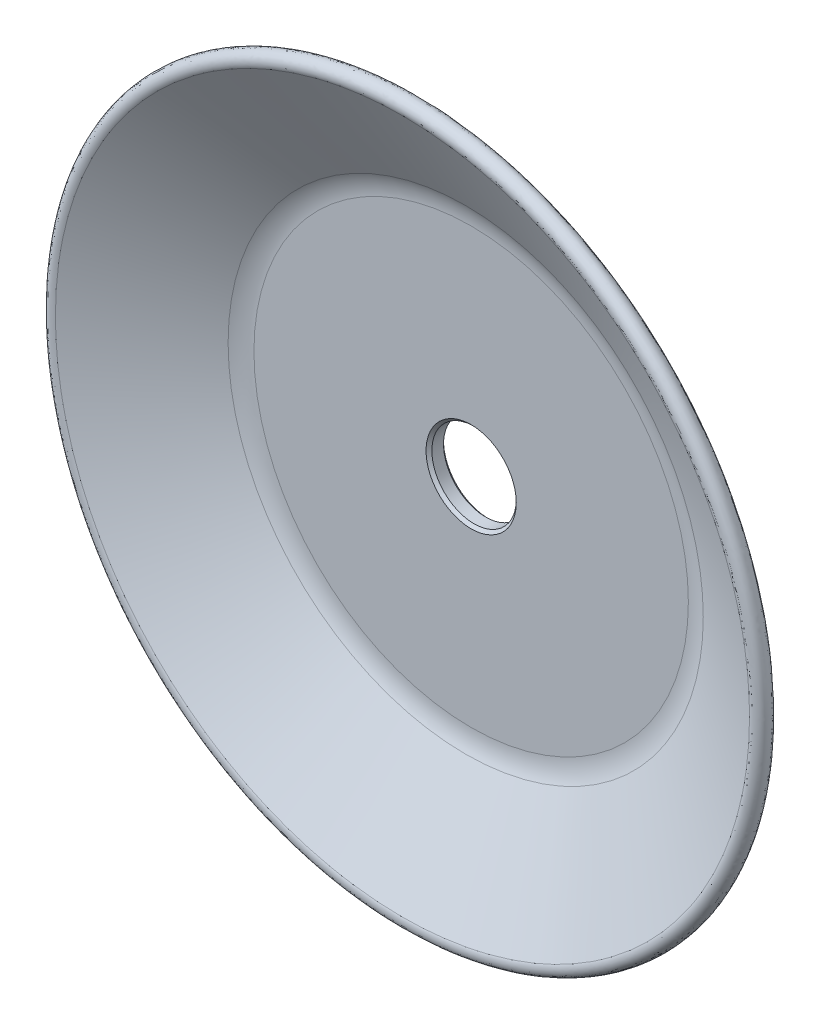
ISO-10303-21;
HEADER;
FILE_DESCRIPTION(('STEP AP214'),'2;1');
FILE_NAME('part.step','',(''),(''),'','','');
FILE_SCHEMA(('AUTOMOTIVE_DESIGN { 1 0 10303 214 1 1 1 1 }'));
ENDSEC;
DATA;
#1=APPLICATION_CONTEXT('core data for automotive mechanical design processes');
#2=APPLICATION_PROTOCOL_DEFINITION('international standard','automotive_design',2000,#1);
#3=PRODUCT_CONTEXT('',#1,'mechanical');
#4=PRODUCT('Part','Part','',(#3));
#5=PRODUCT_RELATED_PRODUCT_CATEGORY('part','',(#4));
#6=PRODUCT_DEFINITION_FORMATION('','',#4);
#7=PRODUCT_DEFINITION_CONTEXT('part definition',#1,'design');
#8=PRODUCT_DEFINITION('design','',#6,#7);
#9=PRODUCT_DEFINITION_SHAPE('','',#8);
#10=(LENGTH_UNIT() NAMED_UNIT(*) SI_UNIT(.MILLI.,.METRE.));
#11=(NAMED_UNIT(*) PLANE_ANGLE_UNIT() SI_UNIT($,.RADIAN.));
#12=(NAMED_UNIT(*) SI_UNIT($,.STERADIAN.) SOLID_ANGLE_UNIT());
#13=UNCERTAINTY_MEASURE_WITH_UNIT(LENGTH_MEASURE(1.E-05),#10,'distance_accuracy_value','');
#14=(GEOMETRIC_REPRESENTATION_CONTEXT(3) GLOBAL_UNCERTAINTY_ASSIGNED_CONTEXT((#13)) GLOBAL_UNIT_ASSIGNED_CONTEXT((#10,
#11,#12)) REPRESENTATION_CONTEXT('',''));
#15=CARTESIAN_POINT('',(0.,0.,0.));
#16=DIRECTION('',(0.,0.,1.));
#17=DIRECTION('',(1.,0.,0.));
#18=AXIS2_PLACEMENT_3D('',#15,#16,#17);
#19=CARTESIAN_POINT('',(-59.6326859021799,-3.25001168292347E-12,14.7990381056767));
#20=CARTESIAN_POINT('',(-59.6326859021768,-7.80532372691678,14.7990381056751));
#21=CARTESIAN_POINT('',(-58.0803860482153,-15.6092620862819,14.7990381056677));
#22=CARTESIAN_POINT('',(-52.1064498991789,-30.0316197581151,14.7990381056856));
#23=CARTESIAN_POINT('',(-47.6858739185271,-36.6474792450666,14.7990381056748));
#24=CARTESIAN_POINT('',(-36.6474792450661,-47.6858739185356,14.7990381056785));
#25=CARTESIAN_POINT('',(-30.0316197582012,-52.1064498991463,14.7990381056867));
#26=CARTESIAN_POINT('',(-15.6092620861839,-58.0803860482529,14.7990381056666));
#27=CARTESIAN_POINT('',(-7.80532372701427,-59.6326859021829,14.7990381056782));
#28=CARTESIAN_POINT('',(7.80532372702071,-59.6326859021768,14.7990381056751));
#29=CARTESIAN_POINT('',(15.6092620861864,-58.0803860482693,14.7990381056754));
#30=CARTESIAN_POINT('',(30.0316197582106,-52.1064498991249,14.7990381056779));
#31=CARTESIAN_POINT('',(36.6474792451761,-47.6858739183642,14.799038105653));
#32=CARTESIAN_POINT('',(47.6858739184261,-36.647479245229,14.7990381057003));
#33=CARTESIAN_POINT('',(52.1064498991436,-30.0316197582001,14.799038105685));
#34=CARTESIAN_POINT('',(58.0803860482556,-15.609262086185,14.7990381056683));
#35=CARTESIAN_POINT('',(59.6326859021829,-7.80532372697825,14.7990381056782));
#36=CARTESIAN_POINT('',(59.6326859021768,7.80532372698474,14.7990381056751));
#37=CARTESIAN_POINT('',(58.0803860482192,15.6092620862699,14.7990381056672));
#38=CARTESIAN_POINT('',(52.106449899175,30.0316197581271,14.7990381056861));
#39=CARTESIAN_POINT('',(47.6858739184794,36.6474792450734,14.7990381056581));
#40=CARTESIAN_POINT('',(36.6474792451137,47.6858739185288,14.7990381056952));
#41=CARTESIAN_POINT('',(30.0316197581487,52.1064498991511,14.7990381056777));
#42=CARTESIAN_POINT('',(15.6092620862363,58.0803860482481,14.7990381056756));
#43=CARTESIAN_POINT('',(7.80532372691029,59.63268590218,14.7990381056765));
#44=CARTESIAN_POINT('',(-7.80532372691677,59.6326859021798,14.7990381056768));
#45=CARTESIAN_POINT('',(-15.609262086271,58.080386048222,14.7990381056689));
#46=CARTESIAN_POINT('',(-30.0316197581259,52.1064498991723,14.7990381056844));
#47=CARTESIAN_POINT('',(-36.6474792451483,47.6858739184453,14.7990381056748));
#48=CARTESIAN_POINT('',(-47.6858739184539,36.6474792451478,14.7990381056785));
#49=CARTESIAN_POINT('',(-52.106449899175,30.03161975812,14.7990381056841));
#50=CARTESIAN_POINT('',(-58.0803860482242,15.609262086265,14.7990381056692));
#51=CARTESIAN_POINT('',(-59.6326859021829,7.80532372691028,14.7990381056782));
#52=CARTESIAN_POINT('',(-59.6326859021799,-3.25001168292347E-12,14.7990381056767));
#53=CARTESIAN_POINT('',(-60.4987113059643,-3.28289302831085E-12,15.2990381056767));
#54=CARTESIAN_POINT('',(-60.4987113059916,-7.92012047050818,15.2990381056426));
#55=CARTESIAN_POINT('',(-58.9244200052748,-15.8346172985172,15.2990381056562));
#56=CARTESIAN_POINT('',(-52.8626222325019,-30.4690916939511,15.2990381056971));
#57=CARTESIAN_POINT('',(-48.379419910053,-37.1786781249908,15.2990381056426));
#58=CARTESIAN_POINT('',(-37.1786781249317,-48.3794199100031,15.2990381057107));
#59=CARTESIAN_POINT('',(-30.4690916939587,-52.8626222325317,15.2990381056562));
#60=CARTESIAN_POINT('',(-15.8346172984975,-58.9244200052501,15.2990381056971));
#61=CARTESIAN_POINT('',(-7.92012047048553,-60.4987113059371,15.2990381057039));
#62=CARTESIAN_POINT('',(7.9201204704921,-60.4987113059916,15.2990381056494));
#63=CARTESIAN_POINT('',(15.8346172985581,-58.9244200052203,15.2990381056562));
#64=CARTESIAN_POINT('',(30.4690916939102,-52.8626222325564,15.2990381056971));
#65=CARTESIAN_POINT('',(37.1786781249908,-48.3794199100529,15.2990381055677));
#66=CARTESIAN_POINT('',(48.3794199100031,-37.1786781249317,15.2990381057856));
#67=CARTESIAN_POINT('',(52.8626222325045,-30.469091693945,15.299038105663));
#68=CARTESIAN_POINT('',(58.9244200052773,-15.8346172985111,15.2990381056903));
#69=CARTESIAN_POINT('',(60.4987113059643,-7.92012047049109,15.2990381056835));
#70=CARTESIAN_POINT('',(60.4987113059643,7.92012047049767,15.2990381056698));
#71=CARTESIAN_POINT('',(58.9244200052748,15.8346172985172,15.2990381056494));
#72=CARTESIAN_POINT('',(52.8626222325019,30.4690916939511,15.2990381057039));
#73=CARTESIAN_POINT('',(48.3794199099984,37.1786781249636,15.299038105663));
#74=CARTESIAN_POINT('',(37.1786781249862,48.3794199100303,15.2990381056903));
#75=CARTESIAN_POINT('',(30.4690916939859,52.8626222325045,15.2990381056494));
#76=CARTESIAN_POINT('',(15.8346172984702,58.9244200052773,15.2990381057039));
#77=CARTESIAN_POINT('',(7.92012047050161,60.4987113059643,15.2990381056562));
#78=CARTESIAN_POINT('',(-7.92012047050819,60.4987113059643,15.2990381056971));
#79=CARTESIAN_POINT('',(-15.8346172984899,58.9244200053293,15.2990381056494));
#80=CARTESIAN_POINT('',(-30.4690916939783,52.8626222324475,15.2990381057039));
#81=CARTESIAN_POINT('',(-37.1786781250181,48.3794199100257,15.2990381056358));
#82=CARTESIAN_POINT('',(-48.3794199099759,37.1786781249589,15.2990381057175));
#83=CARTESIAN_POINT('',(-52.8626222325317,30.4690916939314,15.2990381056494));
#84=CARTESIAN_POINT('',(-58.9244200052501,15.8346172985247,15.2990381057039));
#85=CARTESIAN_POINT('',(-60.4987113059371,7.92012047050162,15.2990381057107));
#86=CARTESIAN_POINT('',(-60.4987113059643,-3.28289302831085E-12,15.2990381056767));
#87=CARTESIAN_POINT('',(-61.9562430606949,-3.34443240059446E-12,15.2745190528383));
#88=CARTESIAN_POINT('',(-61.9562430606404,-8.11332484810206,15.2745190527566));
#89=CARTESIAN_POINT('',(-60.344939875851,-16.2138929831594,15.2745190527906));
#90=CARTESIAN_POINT('',(-54.1352698742873,-31.2053625186719,15.274519052886));
#91=CARTESIAN_POINT('',(-49.5466666231042,-38.0726925871779,15.2745190527361));
#92=CARTESIAN_POINT('',(-38.0726925870097,-49.5466666229455,15.2745190529404));
#93=CARTESIAN_POINT('',(-31.2053625185567,-54.1352698743716,15.2745190527838));
#94=CARTESIAN_POINT('',(-16.2138929832621,-60.3449398757718,15.2745190528928));
#95=CARTESIAN_POINT('',(-8.1133248479032,-61.9562430606404,15.2745190529064));
#96=CARTESIAN_POINT('',(8.11332484790997,-61.9562430607493,15.2745190527702));
#97=CARTESIAN_POINT('',(16.2138929833229,-60.3449398755513,15.2745190527907));
#98=CARTESIAN_POINT('',(31.2053625185084,-54.135269874587,15.274519052886));
#99=CARTESIAN_POINT('',(38.0726925870145,-49.5466666233493,15.2745190525591));
#100=CARTESIAN_POINT('',(49.5466666231089,-38.0726925867645,15.2745190531175));
#101=CARTESIAN_POINT('',(54.1352698743172,-31.2053625185022,15.2745190528111));
#102=CARTESIAN_POINT('',(60.3449398758263,-16.2138929833166,15.2745190528655));
#103=CARTESIAN_POINT('',(61.9562430607494,-8.11332484797304,15.2745190528519));
#104=CARTESIAN_POINT('',(61.9562430606404,8.11332484797978,15.2745190528247));
#105=CARTESIAN_POINT('',(60.3449398759054,16.2138929831321,15.2745190527702));
#106=CARTESIAN_POINT('',(54.1352698742329,31.2053625186991,15.2745190529064));
#107=CARTESIAN_POINT('',(49.5466666231587,38.0726925870689,15.2745190527975));
#108=CARTESIAN_POINT('',(38.0726925869552,49.5466666230545,15.2745190528792));
#109=CARTESIAN_POINT('',(31.2053625186792,54.1352698743989,15.2745190527634));
#110=CARTESIAN_POINT('',(16.2138929831395,60.3449398757446,15.2745190529132));
#111=CARTESIAN_POINT('',(8.11332484809534,61.9562430606404,15.2745190527975));
#112=CARTESIAN_POINT('',(-8.11332484810208,61.9562430607494,15.2745190528792));
#113=CARTESIAN_POINT('',(-16.2138929830912,60.3449398759327,15.2745190527498));
#114=CARTESIAN_POINT('',(-31.2053625187399,54.1352698742056,15.2745190529268));
#115=CARTESIAN_POINT('',(-38.0726925869872,49.5466666231042,15.2745190527157));
#116=CARTESIAN_POINT('',(-49.5466666231362,38.0726925870097,15.2745190529609));
#117=CARTESIAN_POINT('',(-54.1352698743444,31.2053625186247,15.2745190527838));
#118=CARTESIAN_POINT('',(-60.3449398757991,16.213892983194,15.2745190528928));
#119=CARTESIAN_POINT('',(-61.9562430607493,8.11332484809537,15.27451905292));
#120=CARTESIAN_POINT('',(-61.9562430606949,-3.34443240059446E-12,15.2745190528383));
#121=CARTESIAN_POINT('',(-62.7062430606948,-3.38530778169319E-12,13.9754809471617));
#122=CARTESIAN_POINT('',(-62.7062430606948,-8.21274174431131,13.9754809470936));
#123=CARTESIAN_POINT('',(-61.0758947242928,-16.4090563218174,13.9754809471208));
#124=CARTESIAN_POINT('',(-54.7901343246124,-31.5842243285616,13.9754809472025));
#125=CARTESIAN_POINT('',(-50.1472950705333,-38.5327243115013,13.9754809469505));
#126=CARTESIAN_POINT('',(-38.5327243113604,-50.1472950704019,13.9754809473727));
#127=CARTESIAN_POINT('',(-31.5842243283646,-54.7901343246695,13.9754809471003));
#128=CARTESIAN_POINT('',(-16.4090563220017,-61.0758947242409,13.9754809472229));
#129=CARTESIAN_POINT('',(-8.21274174406039,-62.7062430606403,13.9754809472434));
#130=CARTESIAN_POINT('',(8.21274174406724,-62.7062430607493,13.97548094708));
#131=CARTESIAN_POINT('',(16.4090563220353,-61.0758947240204,13.9754809472434));
#132=CARTESIAN_POINT('',(31.5842243283437,-54.7901343248849,13.9754809470799));
#133=CARTESIAN_POINT('',(38.5327243112017,-50.1472950706422,13.975480946685));
#134=CARTESIAN_POINT('',(50.1472950707015,-38.5327243112514,13.9754809476384));
#135=CARTESIAN_POINT('',(54.7901343246423,-31.5842243283374,13.975480947182));
#136=CARTESIAN_POINT('',(61.0758947242681,-16.409056322029,13.9754809471412));
#137=CARTESIAN_POINT('',(62.7062430606949,-8.21274174415485,13.9754809471549));
#138=CARTESIAN_POINT('',(62.7062430606949,8.21274174416167,13.9754809471685));
#139=CARTESIAN_POINT('',(61.0758947242655,16.4090563218037,13.9754809470118));
#140=CARTESIAN_POINT('',(54.7901343246397,31.5842243285752,13.9754809473115));
#141=CARTESIAN_POINT('',(50.1472950704788,38.5327243114741,13.9754809469982));
#142=CARTESIAN_POINT('',(38.5327243114148,50.1472950704292,13.9754809473251));
#143=CARTESIAN_POINT('',(31.5842243285144,54.7901343246695,13.9754809469914));
#144=CARTESIAN_POINT('',(16.4090563218519,61.0758947242409,13.9754809473319));
#145=CARTESIAN_POINT('',(8.21274174430451,62.7062430606404,13.9754809471412));
#146=CARTESIAN_POINT('',(-8.21274174431133,62.7062430607494,13.9754809471821));
#147=CARTESIAN_POINT('',(-16.4090563217492,61.07589472432,13.975480947005));
#148=CARTESIAN_POINT('',(-31.5842243286296,54.7901343245852,13.9754809473183));
#149=CARTESIAN_POINT('',(-38.5327243113379,50.1472950704788,13.9754809469914));
#150=CARTESIAN_POINT('',(-50.1472950705654,38.5327243114149,13.9754809473319));
#151=CARTESIAN_POINT('',(-54.7901343246423,31.5842243284327,13.9754809471208));
#152=CARTESIAN_POINT('',(-61.0758947242681,16.4090563219336,13.9754809472025));
#153=CARTESIAN_POINT('',(-62.7062430606948,8.21274174430454,13.9754809472298));
#154=CARTESIAN_POINT('',(-62.7062430606948,-3.38530778169319E-12,13.9754809471617));
#155=CARTESIAN_POINT('',(-61.9987113059643,-3.36464379050832E-12,12.7009618943234));
#156=CARTESIAN_POINT('',(-61.9987113059098,-8.11895426292668,12.7009618942893));
#157=CARTESIAN_POINT('',(-60.3863297021583,-16.2249439758604,12.7009618942825));
#158=CARTESIAN_POINT('',(-54.1723511331521,-31.2268153137034,12.7009618943642));
#159=CARTESIAN_POINT('',(-49.5806768046387,-38.0987415737194,12.7009618941326));
#160=CARTESIAN_POINT('',(-38.0987415739054,-49.5806768048341,12.700961894514));
#161=CARTESIAN_POINT('',(-31.2268153135746,-54.1723511331002,12.7009618942893));
#162=CARTESIAN_POINT('',(-16.2249439759767,-60.3863297022154,12.7009618943574));
#163=CARTESIAN_POINT('',(-8.1189542627999,-61.9987113059643,12.700961894371));
#164=CARTESIAN_POINT('',(8.11895426280663,-61.9987113059643,12.7009618942757));
#165=CARTESIAN_POINT('',(16.2249439759966,-60.3863297021039,12.700961894405));
#166=CARTESIAN_POINT('',(31.2268153135672,-54.1723511332066,12.7009618942416));
#167=CARTESIAN_POINT('',(38.0987415735016,-49.580676804557,12.7009618938943));
#168=CARTESIAN_POINT('',(49.5806768050521,-38.0987415739871,12.7009618947524));
#169=CARTESIAN_POINT('',(54.1723511331275,-31.2268153135882,12.7009618943437));
#170=CARTESIAN_POINT('',(60.3863297021881,-16.2249439759631,12.7009618943029));
#171=CARTESIAN_POINT('',(61.9987113059916,-8.1189542628547,12.7009618943029));
#172=CARTESIAN_POINT('',(61.9987113059371,8.11895426286145,12.7009618943438));
#173=CARTESIAN_POINT('',(60.3863297021039,16.2249439758195,12.7009618941803));
#174=CARTESIAN_POINT('',(54.1723511332066,31.2268153137442,12.7009618944663));
#175=CARTESIAN_POINT('',(49.5806768046115,38.0987415737467,12.7009618941599));
#176=CARTESIAN_POINT('',(38.0987415739326,49.5806768048069,12.7009618944868));
#177=CARTESIAN_POINT('',(31.2268153136154,54.1723511330185,12.7009618941735));
#178=CARTESIAN_POINT('',(16.2249439759358,60.3863297022972,12.7009618944731));
#179=CARTESIAN_POINT('',(8.11895426291994,61.9987113059643,12.7009618943302));
#180=CARTESIAN_POINT('',(-8.11895426292668,61.9987113059643,12.7009618943165));
#181=CARTESIAN_POINT('',(-16.2249439757922,60.3863297021311,12.7009618941803));
#182=CARTESIAN_POINT('',(-31.2268153137714,54.1723511331794,12.7009618944663));
#183=CARTESIAN_POINT('',(-38.098741573665,49.5806768046659,12.7009618941735));
#184=CARTESIAN_POINT('',(-49.5806768048886,38.0987415738782,12.7009618944731));
#185=CARTESIAN_POINT('',(-54.1723511331002,31.226815313629,12.7009618943097));
#186=CARTESIAN_POINT('',(-60.3863297022154,16.2249439759222,12.7009618943369));
#187=CARTESIAN_POINT('',(-61.9987113060188,8.11895426291995,12.7009618943574));
#188=CARTESIAN_POINT('',(-61.9987113059643,-3.36464379050832E-12,12.7009618943234));
#189=CARTESIAN_POINT('',(-61.1326859021799,-3.33176244512093E-12,12.2009618943233));
#190=CARTESIAN_POINT('',(-61.1326859021271,-8.00415751933527,12.2009618942931));
#191=CARTESIAN_POINT('',(-59.5422957451054,-15.9995887636278,12.2009618942953));
#192=CARTESIAN_POINT('',(-53.4161787998226,-30.7893433778646,12.2009618943514));
#193=CARTESIAN_POINT('',(-48.8871308131177,-37.5675426937728,12.2009618942142));
#194=CARTESIAN_POINT('',(-37.5675426940349,-48.887130813389,12.2009618944324));
#195=CARTESIAN_POINT('',(-30.7893433778185,-53.4161787997456,12.2009618942996));
#196=CARTESIAN_POINT('',(-15.9995887636617,-59.5422957451875,12.2009618943471));
#197=CARTESIAN_POINT('',(-8.00415751932864,-61.1326859022063,12.2009618943384));
#198=CARTESIAN_POINT('',(8.00415751933524,-61.1326859021535,12.2009618943083));
#199=CARTESIAN_POINT('',(15.9995887636525,-59.5422957451809,12.200961894341));
#200=CARTESIAN_POINT('',(30.78934337784,-53.4161787997471,12.2009618943056));
#201=CARTESIAN_POINT('',(37.5675426936615,-48.8871308128429,12.2009618940566));
#202=CARTESIAN_POINT('',(48.8871308135004,-37.5675426943097,12.2009618945901));
#203=CARTESIAN_POINT('',(53.4161787997969,-30.7893433778445,12.2009618943327));
#204=CARTESIAN_POINT('',(59.5422957451361,-15.9995887636357,12.2009618943139));
#205=CARTESIAN_POINT('',(61.1326859021741,-8.00415751934186,12.2009618943198));
#206=CARTESIAN_POINT('',(61.1326859021857,8.00415751934852,12.2009618943269));
#207=CARTESIAN_POINT('',(59.5422957450214,15.9995887635724,12.2009618942383));
#208=CARTESIAN_POINT('',(53.4161787999066,30.78934337792,12.2009618944084));
#209=CARTESIAN_POINT('',(48.8871308130653,37.5675426938295,12.2009618942159));
#210=CARTESIAN_POINT('',(37.5675426940873,48.8871308133325,12.2009618944308));
#211=CARTESIAN_POINT('',(30.7893433777775,53.4161787996363,12.2009618942322));
#212=CARTESIAN_POINT('',(15.9995887637026,59.5422957452968,12.2009618944145));
#213=CARTESIAN_POINT('',(8.00415751932862,61.13268590218,12.2009618943232));
#214=CARTESIAN_POINT('',(-8.00415751933526,61.1326859021798,12.2009618943235));
#215=CARTESIAN_POINT('',(-15.9995887635701,59.542295745016,12.2009618942349));
#216=CARTESIAN_POINT('',(-30.7893433779223,53.416178799912,12.2009618944118));
#217=CARTESIAN_POINT('',(-37.5675426937967,48.8871308131143,12.2009618942225));
#218=CARTESIAN_POINT('',(-48.8871308133653,37.5675426940383,12.2009618944241));
#219=CARTESIAN_POINT('',(-53.4161787997712,30.7893433778315,12.2009618943161));
#220=CARTESIAN_POINT('',(-59.5422957451618,15.9995887636486,12.2009618943305));
#221=CARTESIAN_POINT('',(-61.1326859022327,8.00415751932861,12.2009618943536));
#222=CARTESIAN_POINT('',(-61.1326859021799,-3.33176244512093E-12,12.2009618943233));
#223=(BOUNDED_SURFACE() B_SPLINE_SURFACE(5,3,((#19,#20,#21,#22,#23,#24,#25,#26,#27,#28,#29,#30,
#31,#32,#33,#34,#35,#36,#37,#38,#39,#40,#41,#42,#43,#44,#45,#46,#47,#48,#49,#50,#51,#52),(#53,
#54,#55,#56,#57,#58,#59,#60,#61,#62,#63,#64,#65,#66,#67,#68,#69,#70,#71,#72,#73,#74,#75,#76,#77,
#78,#79,#80,#81,#82,#83,#84,#85,#86),(#87,#88,#89,#90,#91,#92,#93,#94,#95,#96,#97,#98,#99,#100,
#101,#102,#103,#104,#105,#106,#107,#108,#109,#110,#111,#112,#113,#114,#115,#116,#117,#118,#119,
#120),(#121,#122,#123,#124,#125,#126,#127,#128,#129,#130,#131,#132,#133,#134,#135,#136,#137,
#138,#139,#140,#141,#142,#143,#144,#145,#146,#147,#148,#149,#150,#151,#152,#153,#154),(#155,
#156,#157,#158,#159,#160,#161,#162,#163,#164,#165,#166,#167,#168,#169,#170,#171,#172,#173,#174,
#175,#176,#177,#178,#179,#180,#181,#182,#183,#184,#185,#186,#187,#188),(#189,#190,#191,#192,
#193,#194,#195,#196,#197,#198,#199,#200,#201,#202,#203,#204,#205,#206,#207,#208,#209,#210,#211,
#212,#213,#214,#215,#216,#217,#218,#219,#220,#221,#222)),.UNSPECIFIED.,.F.,.T.,
.F.) B_SPLINE_SURFACE_WITH_KNOTS((6,6),(4,2,2,2,2,2,2,2,2,2,2,2,2,2,2,2,4),(0.,1.),
(0.500000000000009,0.562500000000009,0.625000000000009,0.687500000000009,0.750000000000009,
0.812500000000009,0.875000000000009,0.937500000000009,1.00000000000001,1.06250000000001,
1.12500000000001,1.18750000000001,1.25000000000001,1.31250000000001,1.37500000000001,
1.43750000000001,1.50000000000001),
.UNSPECIFIED.) GEOMETRIC_REPRESENTATION_ITEM() RATIONAL_B_SPLINE_SURFACE(((1.,1.,1.,1.,1.,1.,1.,
1.,1.,1.,1.,1.,1.,1.,1.,1.,1.,1.,1.,1.,1.,1.,1.,1.,1.,1.,1.,1.,1.,1.,1.,1.,1.,1.),
(0.600000000000003,0.600000000000003,0.599999999999998,0.599999999999998,0.599999999999998,
0.599999999999998,0.599999999999997,0.599999999999997,0.600000000000004,0.600000000000004,
0.599999999999997,0.599999999999997,0.600000000000005,0.600000000000005,0.599999999999996,
0.599999999999996,0.6,0.6,0.599999999999999,0.599999999999999,0.599999999999998,
0.599999999999998,0.599999999999998,0.599999999999998,0.599999999999998,0.599999999999998,
0.599999999999999,0.599999999999999,0.599999999999997,0.599999999999997,0.599999999999998,
0.599999999999998,0.600000000000003,0.600000000000003),(0.400000000000005,0.400000000000005,
0.399999999999997,0.399999999999997,0.399999999999996,0.399999999999996,0.399999999999996,
0.399999999999996,0.400000000000006,0.400000000000006,0.399999999999996,0.399999999999996,
0.400000000000008,0.400000000000008,0.399999999999994,0.399999999999994,0.4,0.4,
0.399999999999999,0.399999999999999,0.399999999999998,0.399999999999998,0.399999999999997,
0.399999999999997,0.399999999999997,0.399999999999997,0.399999999999998,0.399999999999998,
0.399999999999995,0.399999999999995,0.399999999999997,0.399999999999997,0.400000000000005,
0.400000000000005),(0.400000000000005,0.400000000000005,0.399999999999997,0.399999999999997,
0.399999999999996,0.399999999999996,0.399999999999996,0.399999999999996,0.400000000000006,
0.400000000000006,0.399999999999996,0.399999999999996,0.400000000000008,0.400000000000008,
0.399999999999994,0.399999999999994,0.4,0.4,0.399999999999999,0.399999999999999,
0.399999999999998,0.399999999999998,0.399999999999997,0.399999999999997,0.399999999999997,
0.399999999999997,0.399999999999998,0.399999999999998,0.399999999999995,0.399999999999995,
0.399999999999997,0.399999999999997,0.400000000000005,0.400000000000005),(0.600000000000003,
0.600000000000003,0.599999999999998,0.599999999999998,0.599999999999998,0.599999999999998,
0.599999999999997,0.599999999999997,0.600000000000004,0.600000000000004,0.599999999999997,
0.599999999999997,0.600000000000005,0.600000000000005,0.599999999999996,0.599999999999996,0.6,
0.6,0.599999999999999,0.599999999999999,0.599999999999998,0.599999999999998,0.599999999999998,
0.599999999999998,0.599999999999998,0.599999999999998,0.599999999999999,0.599999999999999,
0.599999999999997,0.599999999999997,0.599999999999998,0.599999999999998,0.600000000000003,
0.600000000000003),(1.,1.,1.,1.,1.,1.,1.,1.,1.,1.,1.,1.,1.,1.,1.,1.,1.,1.,1.,1.,1.,1.,1.,1.,1.,
1.,1.,1.,1.,1.,1.,1.,1.,1.))) REPRESENTATION_ITEM('') SURFACE());
#224=CARTESIAN_POINT('',(-59.6326859021799,-3.25001168292347E-12,14.7990381056767));
#225=CARTESIAN_POINT('',(-59.6326859021829,7.80532372691028,14.7990381056782));
#226=CARTESIAN_POINT('',(-58.0803860482242,15.609262086265,14.7990381056692));
#227=CARTESIAN_POINT('',(-52.106449899175,30.03161975812,14.7990381056841));
#228=CARTESIAN_POINT('',(-47.6858739184539,36.6474792451478,14.7990381056785));
#229=CARTESIAN_POINT('',(-36.6474792451483,47.6858739184453,14.7990381056748));
#230=CARTESIAN_POINT('',(-30.0316197581259,52.1064498991723,14.7990381056844));
#231=CARTESIAN_POINT('',(-15.609262086271,58.080386048222,14.7990381056689));
#232=CARTESIAN_POINT('',(-7.80532372691677,59.6326859021798,14.7990381056768));
#233=CARTESIAN_POINT('',(7.80532372691029,59.63268590218,14.7990381056765));
#234=CARTESIAN_POINT('',(15.6092620862363,58.0803860482481,14.7990381056756));
#235=CARTESIAN_POINT('',(30.0316197581487,52.1064498991511,14.7990381056777));
#236=CARTESIAN_POINT('',(36.6474792451137,47.6858739185288,14.7990381056952));
#237=CARTESIAN_POINT('',(47.6858739184794,36.6474792450734,14.7990381056581));
#238=CARTESIAN_POINT('',(52.106449899175,30.0316197581271,14.7990381056861));
#239=CARTESIAN_POINT('',(58.0803860482192,15.6092620862699,14.7990381056672));
#240=CARTESIAN_POINT('',(59.6326859021768,7.80532372698474,14.7990381056751));
#241=CARTESIAN_POINT('',(59.6326859021829,-7.80532372697825,14.7990381056782));
#242=CARTESIAN_POINT('',(58.0803860482556,-15.609262086185,14.7990381056683));
#243=CARTESIAN_POINT('',(52.1064498991436,-30.0316197582001,14.799038105685));
#244=CARTESIAN_POINT('',(47.6858739184261,-36.647479245229,14.7990381057003));
#245=CARTESIAN_POINT('',(36.6474792451761,-47.6858739183642,14.799038105653));
#246=CARTESIAN_POINT('',(30.0316197582106,-52.1064498991249,14.7990381056779));
#247=CARTESIAN_POINT('',(15.6092620861864,-58.0803860482693,14.7990381056754));
#248=CARTESIAN_POINT('',(7.80532372702071,-59.6326859021768,14.7990381056751));
#249=CARTESIAN_POINT('',(-7.80532372701427,-59.6326859021829,14.7990381056782));
#250=CARTESIAN_POINT('',(-15.6092620861839,-58.0803860482529,14.7990381056666));
#251=CARTESIAN_POINT('',(-30.0316197582012,-52.1064498991463,14.7990381056867));
#252=CARTESIAN_POINT('',(-36.6474792450661,-47.6858739185356,14.7990381056785));
#253=CARTESIAN_POINT('',(-47.6858739185271,-36.6474792450666,14.7990381056748));
#254=CARTESIAN_POINT('',(-52.1064498991789,-30.0316197581151,14.7990381056856));
#255=CARTESIAN_POINT('',(-58.0803860482153,-15.6092620862819,14.7990381056677));
#256=CARTESIAN_POINT('',(-59.6326859021768,-7.80532372691678,14.7990381056751));
#257=CARTESIAN_POINT('',(-59.6326859021799,-3.25001168292347E-12,14.7990381056767));
#258=(BOUNDED_CURVE() B_SPLINE_CURVE(3,(#224,#225,#226,#227,#228,#229,#230,#231,#232,#233,#234,
#235,#236,#237,#238,#239,#240,#241,#242,#243,#244,#245,#246,#247,#248,#249,#250,#251,#252,#253,
#254,#255,#256,#257),.UNSPECIFIED.,.T.,.F.) B_SPLINE_CURVE_WITH_KNOTS((4,2,2,2,2,2,2,2,2,2,2,2,
2,2,2,2,4),(0.500000000000009,0.562500000000009,0.625000000000009,0.687500000000009,
0.750000000000009,0.812500000000009,0.875000000000009,0.937500000000009,1.00000000000001,
1.06250000000001,1.12500000000001,1.18750000000001,1.25000000000001,1.31250000000001,
1.37500000000001,1.43750000000001,1.50000000000001),
.UNSPECIFIED.) CURVE() GEOMETRIC_REPRESENTATION_ITEM() RATIONAL_B_SPLINE_CURVE((1.,1.,1.,1.,1.,
1.,1.,1.,1.,1.,1.,1.,1.,1.,1.,1.,1.,1.,1.,1.,1.,1.,1.,1.,1.,1.,1.,1.,1.,1.,1.,1.,1.,1.)) REPRESENTATION_ITEM(''));
#259=CARTESIAN_POINT('',(-59.6326859021799,-3.25001168292347E-12,14.7990381056767));
#260=VERTEX_POINT('',#259);
#261=EDGE_CURVE('E111',#260,#260,#258,.F.);
#262=CARTESIAN_POINT('',(-61.1326859021799,-3.33176244512093E-12,12.2009618943233));
#263=CARTESIAN_POINT('',(-61.1326859021271,-8.00415751933527,12.2009618942931));
#264=CARTESIAN_POINT('',(-59.5422957451054,-15.9995887636278,12.2009618942953));
#265=CARTESIAN_POINT('',(-53.4161787998226,-30.7893433778646,12.2009618943514));
#266=CARTESIAN_POINT('',(-48.8871308131177,-37.5675426937728,12.2009618942142));
#267=CARTESIAN_POINT('',(-37.5675426940349,-48.887130813389,12.2009618944324));
#268=CARTESIAN_POINT('',(-30.7893433778185,-53.4161787997456,12.2009618942996));
#269=CARTESIAN_POINT('',(-15.9995887636617,-59.5422957451875,12.2009618943471));
#270=CARTESIAN_POINT('',(-8.00415751932864,-61.1326859022063,12.2009618943384));
#271=CARTESIAN_POINT('',(8.00415751933524,-61.1326859021535,12.2009618943083));
#272=CARTESIAN_POINT('',(15.9995887636525,-59.5422957451809,12.200961894341));
#273=CARTESIAN_POINT('',(30.78934337784,-53.4161787997471,12.2009618943056));
#274=CARTESIAN_POINT('',(37.5675426936615,-48.8871308128429,12.2009618940566));
#275=CARTESIAN_POINT('',(48.8871308135004,-37.5675426943097,12.2009618945901));
#276=CARTESIAN_POINT('',(53.4161787997969,-30.7893433778445,12.2009618943327));
#277=CARTESIAN_POINT('',(59.5422957451361,-15.9995887636357,12.2009618943139));
#278=CARTESIAN_POINT('',(61.1326859021741,-8.00415751934186,12.2009618943198));
#279=CARTESIAN_POINT('',(61.1326859021857,8.00415751934852,12.2009618943269));
#280=CARTESIAN_POINT('',(59.5422957450214,15.9995887635724,12.2009618942383));
#281=CARTESIAN_POINT('',(53.4161787999066,30.78934337792,12.2009618944084));
#282=CARTESIAN_POINT('',(48.8871308130653,37.5675426938295,12.2009618942159));
#283=CARTESIAN_POINT('',(37.5675426940873,48.8871308133325,12.2009618944308));
#284=CARTESIAN_POINT('',(30.7893433777775,53.4161787996363,12.2009618942322));
#285=CARTESIAN_POINT('',(15.9995887637026,59.5422957452968,12.2009618944145));
#286=CARTESIAN_POINT('',(8.00415751932862,61.13268590218,12.2009618943232));
#287=CARTESIAN_POINT('',(-8.00415751933526,61.1326859021798,12.2009618943235));
#288=CARTESIAN_POINT('',(-15.9995887635701,59.542295745016,12.2009618942349));
#289=CARTESIAN_POINT('',(-30.7893433779223,53.416178799912,12.2009618944118));
#290=CARTESIAN_POINT('',(-37.5675426937967,48.8871308131143,12.2009618942225));
#291=CARTESIAN_POINT('',(-48.8871308133653,37.5675426940383,12.2009618944241));
#292=CARTESIAN_POINT('',(-53.4161787997712,30.7893433778315,12.2009618943161));
#293=CARTESIAN_POINT('',(-59.5422957451618,15.9995887636486,12.2009618943305));
#294=CARTESIAN_POINT('',(-61.1326859022327,8.00415751932861,12.2009618943536));
#295=CARTESIAN_POINT('',(-61.1326859021799,-3.33176244512093E-12,12.2009618943233));
#296=(BOUNDED_CURVE() B_SPLINE_CURVE(3,(#262,#263,#264,#265,#266,#267,#268,#269,#270,#271,#272,
#273,#274,#275,#276,#277,#278,#279,#280,#281,#282,#283,#284,#285,#286,#287,#288,#289,#290,#291,
#292,#293,#294,#295),.UNSPECIFIED.,.T.,.F.) B_SPLINE_CURVE_WITH_KNOTS((4,2,2,2,2,2,2,2,2,2,2,2,
2,2,2,2,4),(0.500000000000009,0.562500000000009,0.625000000000009,0.687500000000009,
0.750000000000009,0.812500000000009,0.875000000000009,0.937500000000009,1.00000000000001,
1.06250000000001,1.12500000000001,1.18750000000001,1.25000000000001,1.31250000000001,
1.37500000000001,1.43750000000001,1.50000000000001),
.UNSPECIFIED.) CURVE() GEOMETRIC_REPRESENTATION_ITEM() RATIONAL_B_SPLINE_CURVE((1.,1.,1.,1.,1.,
1.,1.,1.,1.,1.,1.,1.,1.,1.,1.,1.,1.,1.,1.,1.,1.,1.,1.,1.,1.,1.,1.,1.,1.,1.,1.,1.,1.,1.)) REPRESENTATION_ITEM(''));
#297=CARTESIAN_POINT('',(-61.1326859021799,-3.33176244512093E-12,12.2009618943233));
#298=VERTEX_POINT('',#297);
#299=EDGE_CURVE('E69',#298,#298,#296,.F.);
#300=ORIENTED_EDGE('',*,*,#261,.F.);
#301=EDGE_LOOP('',(#300));
#302=FACE_BOUND('',#301,.T.);
#303=ORIENTED_EDGE('',*,*,#299,.F.);
#304=EDGE_LOOP('',(#303));
#305=FACE_BOUND('',#304,.T.);
#306=ADVANCED_FACE('F44',(#302,#305),#223,.T.);
#307=CARTESIAN_POINT('',(0.,0.,0.));
#308=DIRECTION('',(0.,0.,1.));
#309=DIRECTION('',(1.,0.,0.));
#310=AXIS2_PLACEMENT_3D('',#307,#308,#309);
#311=CONICAL_SURFACE('',#310,40.,1.0471975511966);
#312=ORIENTED_EDGE('',*,*,#299,.T.);
#313=EDGE_LOOP('',(#312));
#314=FACE_BOUND('',#313,.T.);
#315=CARTESIAN_POINT('',(0.,0.,1.3397459621556));
#316=DIRECTION('',(0.,0.,-1.));
#317=DIRECTION('',(-1.,0.,0.));
#318=AXIS2_PLACEMENT_3D('',#315,#316,#317);
#319=CIRCLE('',#318,42.3205080756888);
#320=CARTESIAN_POINT('',(-42.3205080756888,0.,1.3397459621556));
#321=VERTEX_POINT('',#320);
#322=EDGE_CURVE('E155',#321,#321,#319,.F.);
#323=ORIENTED_EDGE('',*,*,#322,.T.);
#324=EDGE_LOOP('',(#323));
#325=FACE_BOUND('',#324,.T.);
#326=ADVANCED_FACE('F89',(#314,#325),#311,.T.);
#327=CARTESIAN_POINT('',(0.,0.,0.));
#328=DIRECTION('',(0.,0.,1.));
#329=DIRECTION('',(1.,0.,0.));
#330=AXIS2_PLACEMENT_3D('',#327,#328,#329);
#331=PLANE('',#330);
#332=CARTESIAN_POINT('',(0.,0.,0.));
#333=DIRECTION('',(0.,0.,1.));
#334=DIRECTION('',(1.,0.,0.));
#335=AXIS2_PLACEMENT_3D('',#332,#333,#334);
#336=CIRCLE('',#335,7.75000000000002);
#337=CARTESIAN_POINT('',(7.75000000000002,0.,0.));
#338=VERTEX_POINT('',#337);
#339=EDGE_CURVE('E10',#338,#338,#336,.T.);
#340=ORIENTED_EDGE('',*,*,#339,.T.);
#341=EDGE_LOOP('',(#340));
#342=FACE_BOUND('',#341,.T.);
#343=CARTESIAN_POINT('',(0.,0.,0.));
#344=DIRECTION('',(0.,0.,1.));
#345=DIRECTION('',(1.,0.,0.));
#346=AXIS2_PLACEMENT_3D('',#343,#344,#345);
#347=CIRCLE('',#346,37.3205080756888);
#348=CARTESIAN_POINT('',(37.3205080756888,0.,0.));
#349=VERTEX_POINT('',#348);
#350=EDGE_CURVE('E151',#349,#349,#347,.F.);
#351=ORIENTED_EDGE('',*,*,#350,.T.);
#352=EDGE_LOOP('',(#351));
#353=FACE_BOUND('',#352,.T.);
#354=ADVANCED_FACE('F125',(#342,#353),#331,.F.);
#355=CARTESIAN_POINT('',(0.,0.,10.));
#356=DIRECTION('',(0.,0.,1.));
#357=DIRECTION('',(1.,0.,0.));
#358=AXIS2_PLACEMENT_3D('',#355,#356,#357);
#359=TOROIDAL_SURFACE('',#358,37.3205080756888,10.);
#360=ORIENTED_EDGE('',*,*,#350,.F.);
#361=EDGE_LOOP('',(#360));
#362=FACE_BOUND('',#361,.T.);
#363=ORIENTED_EDGE('',*,*,#322,.F.);
#364=EDGE_LOOP('',(#363));
#365=FACE_BOUND('',#364,.T.);
#366=ADVANCED_FACE('F91',(#362,#365),#359,.T.);
#367=CARTESIAN_POINT('',(0.,0.,2.59807621135332));
#368=DIRECTION('',(0.,0.,1.));
#369=DIRECTION('',(1.,0.,0.));
#370=AXIS2_PLACEMENT_3D('',#367,#368,#369);
#371=CONICAL_SURFACE('',#370,38.5,1.0471975511966);
#372=ORIENTED_EDGE('',*,*,#261,.T.);
#373=EDGE_LOOP('',(#372));
#374=FACE_BOUND('',#373,.T.);
#375=CARTESIAN_POINT('',(0.,0.,3.93782217350892));
#376=DIRECTION('',(0.,0.,1.));
#377=DIRECTION('',(1.,0.,0.));
#378=AXIS2_PLACEMENT_3D('',#375,#376,#377);
#379=CIRCLE('',#378,40.8205080756888);
#380=CARTESIAN_POINT('',(40.8205080756888,0.,3.93782217350892));
#381=VERTEX_POINT('',#380);
#382=EDGE_CURVE('E163',#381,#381,#379,.T.);
#383=ORIENTED_EDGE('',*,*,#382,.F.);
#384=EDGE_LOOP('',(#383));
#385=FACE_BOUND('',#384,.T.);
#386=ADVANCED_FACE('F137',(#374,#385),#371,.F.);
#387=CARTESIAN_POINT('',(0.,0.,3.));
#388=DIRECTION('',(0.,0.,1.));
#389=DIRECTION('',(1.,0.,0.));
#390=AXIS2_PLACEMENT_3D('',#387,#388,#389);
#391=PLANE('',#390);
#392=CARTESIAN_POINT('',(0.,0.,3.));
#393=DIRECTION('',(0.,0.,1.));
#394=DIRECTION('',(1.,0.,0.));
#395=AXIS2_PLACEMENT_3D('',#392,#393,#394);
#396=CIRCLE('',#395,7.75000000000003);
#397=CARTESIAN_POINT('',(7.75000000000003,0.,3.));
#398=VERTEX_POINT('',#397);
#399=EDGE_CURVE('E53',#398,#398,#396,.F.);
#400=ORIENTED_EDGE('',*,*,#399,.T.);
#401=EDGE_LOOP('',(#400));
#402=FACE_BOUND('',#401,.T.);
#403=CARTESIAN_POINT('',(0.,0.,3.));
#404=DIRECTION('',(0.,0.,1.));
#405=DIRECTION('',(1.,0.,0.));
#406=AXIS2_PLACEMENT_3D('',#403,#404,#405);
#407=CIRCLE('',#406,37.3205080756888);
#408=CARTESIAN_POINT('',(37.3205080756888,0.,3.));
#409=VERTEX_POINT('',#408);
#410=EDGE_CURVE('E159',#409,#409,#407,.F.);
#411=ORIENTED_EDGE('',*,*,#410,.F.);
#412=EDGE_LOOP('',(#411));
#413=FACE_BOUND('',#412,.T.);
#414=ADVANCED_FACE('F133',(#402,#413),#391,.T.);
#415=CARTESIAN_POINT('',(0.,0.,10.));
#416=DIRECTION('',(0.,0.,1.));
#417=DIRECTION('',(1.,0.,0.));
#418=AXIS2_PLACEMENT_3D('',#415,#416,#417);
#419=TOROIDAL_SURFACE('',#418,37.3205080756888,7.);
#420=ORIENTED_EDGE('',*,*,#410,.T.);
#421=EDGE_LOOP('',(#420));
#422=FACE_BOUND('',#421,.T.);
#423=ORIENTED_EDGE('',*,*,#382,.T.);
#424=EDGE_LOOP('',(#423));
#425=FACE_BOUND('',#424,.T.);
#426=ADVANCED_FACE('F129',(#422,#425),#419,.F.);
#427=CARTESIAN_POINT('',(0.,0.,0.));
#428=DIRECTION('',(0.,0.,1.));
#429=DIRECTION('',(1.,0.,0.));
#430=AXIS2_PLACEMENT_3D('',#427,#428,#429);
#431=CYLINDRICAL_SURFACE('',#430,7.25);
#432=CARTESIAN_POINT('',(0.,0.,2.49999999999997));
#433=DIRECTION('',(0.,0.,1.));
#434=DIRECTION('',(1.,0.,0.));
#435=AXIS2_PLACEMENT_3D('',#432,#433,#434);
#436=CIRCLE('',#435,7.25);
#437=CARTESIAN_POINT('',(7.25,0.,2.49999999999997));
#438=VERTEX_POINT('',#437);
#439=EDGE_CURVE('E58',#438,#438,#436,.T.);
#440=ORIENTED_EDGE('',*,*,#439,.T.);
#441=EDGE_LOOP('',(#440));
#442=FACE_BOUND('',#441,.T.);
#443=CARTESIAN_POINT('',(0.,0.,0.500000000000008));
#444=DIRECTION('',(0.,0.,1.));
#445=DIRECTION('',(1.,0.,0.));
#446=AXIS2_PLACEMENT_3D('',#443,#444,#445);
#447=CIRCLE('',#446,7.25);
#448=CARTESIAN_POINT('',(7.25,0.,0.500000000000008));
#449=VERTEX_POINT('',#448);
#450=EDGE_CURVE('E63',#449,#449,#447,.F.);
#451=ORIENTED_EDGE('',*,*,#450,.T.);
#452=EDGE_LOOP('',(#451));
#453=FACE_BOUND('',#452,.T.);
#454=ADVANCED_FACE('F132',(#442,#453),#431,.F.);
#455=CARTESIAN_POINT('',(0.,0.,2.49999999999997));
#456=DIRECTION('',(0.,0.,1.));
#457=DIRECTION('',(1.,0.,0.));
#458=AXIS2_PLACEMENT_3D('',#455,#456,#457);
#459=CONICAL_SURFACE('',#458,7.25,0.785398163397449);
#460=ORIENTED_EDGE('',*,*,#399,.F.);
#461=EDGE_LOOP('',(#460));
#462=FACE_BOUND('',#461,.T.);
#463=ORIENTED_EDGE('',*,*,#439,.F.);
#464=EDGE_LOOP('',(#463));
#465=FACE_BOUND('',#464,.T.);
#466=ADVANCED_FACE('F93',(#462,#465),#459,.F.);
#467=CARTESIAN_POINT('',(0.,0.,0.));
#468=DIRECTION('',(0.,0.,-1.));
#469=DIRECTION('',(-1.,0.,0.));
#470=AXIS2_PLACEMENT_3D('',#467,#468,#469);
#471=CONICAL_SURFACE('',#470,7.75000000000002,0.78539816339746);
#472=ORIENTED_EDGE('',*,*,#450,.F.);
#473=EDGE_LOOP('',(#472));
#474=FACE_BOUND('',#473,.T.);
#475=ORIENTED_EDGE('',*,*,#339,.F.);
#476=EDGE_LOOP('',(#475));
#477=FACE_BOUND('',#476,.T.);
#478=ADVANCED_FACE('F47',(#474,#477),#471,.F.);
#479=CLOSED_SHELL('',(#306,#326,#354,#366,#386,#414,#426,#454,#466,#478));
#480=MANIFOLD_SOLID_BREP('B2',#479);
#481=ADVANCED_BREP_SHAPE_REPRESENTATION('',(#18,#480),#14);
#482=SHAPE_DEFINITION_REPRESENTATION(#9,#481);
ENDSEC;
END-ISO-10303-21;
